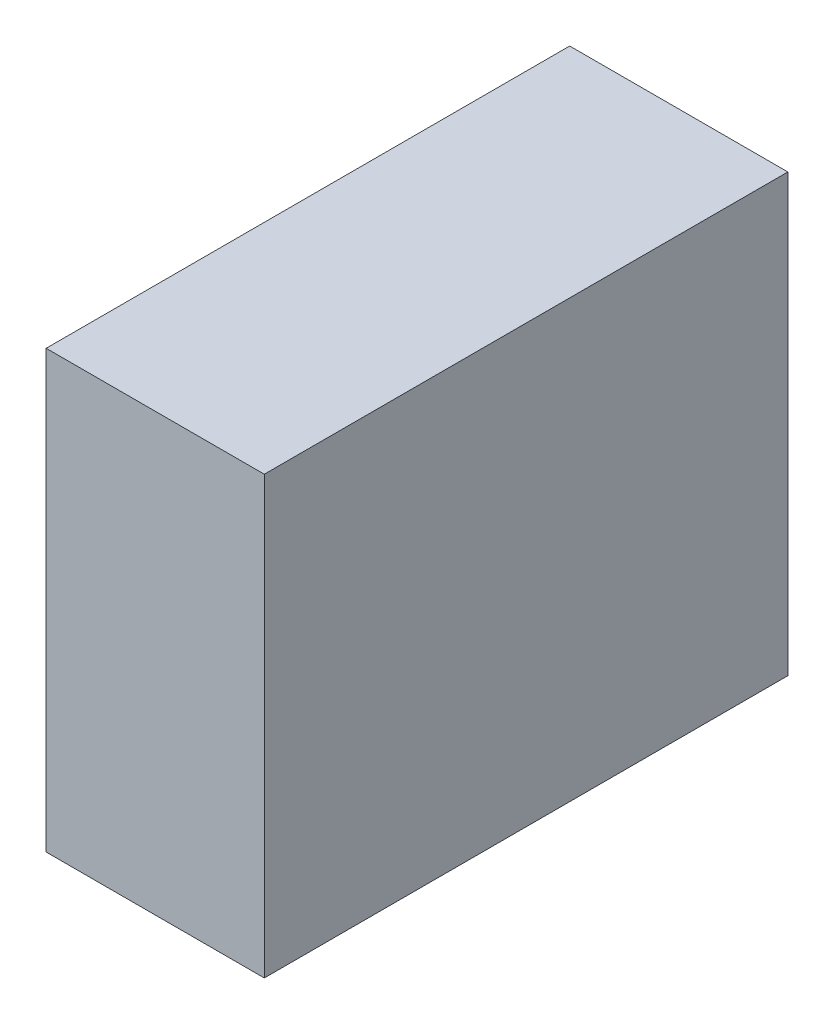
ISO-10303-21;
HEADER;
FILE_DESCRIPTION(('STEP AP214'),'2;1');
FILE_NAME('part.step','',(''),(''),'','','');
FILE_SCHEMA(('AUTOMOTIVE_DESIGN { 1 0 10303 214 1 1 1 1 }'));
ENDSEC;
DATA;
#1=APPLICATION_CONTEXT('core data for automotive mechanical design processes');
#2=APPLICATION_PROTOCOL_DEFINITION('international standard','automotive_design',2000,#1);
#3=PRODUCT_CONTEXT('',#1,'mechanical');
#4=PRODUCT('Part','Part','',(#3));
#5=PRODUCT_RELATED_PRODUCT_CATEGORY('part','',(#4));
#6=PRODUCT_DEFINITION_FORMATION('','',#4);
#7=PRODUCT_DEFINITION_CONTEXT('part definition',#1,'design');
#8=PRODUCT_DEFINITION('design','',#6,#7);
#9=PRODUCT_DEFINITION_SHAPE('','',#8);
#10=(LENGTH_UNIT() NAMED_UNIT(*) SI_UNIT(.MILLI.,.METRE.));
#11=(NAMED_UNIT(*) PLANE_ANGLE_UNIT() SI_UNIT($,.RADIAN.));
#12=(NAMED_UNIT(*) SI_UNIT($,.STERADIAN.) SOLID_ANGLE_UNIT());
#13=UNCERTAINTY_MEASURE_WITH_UNIT(LENGTH_MEASURE(1.E-05),#10,'distance_accuracy_value','');
#14=(GEOMETRIC_REPRESENTATION_CONTEXT(3) GLOBAL_UNCERTAINTY_ASSIGNED_CONTEXT((#13)) GLOBAL_UNIT_ASSIGNED_CONTEXT((#10,
#11,#12)) REPRESENTATION_CONTEXT('',''));
#15=CARTESIAN_POINT('',(0.,0.,0.));
#16=DIRECTION('',(0.,0.,1.));
#17=DIRECTION('',(1.,0.,0.));
#18=AXIS2_PLACEMENT_3D('',#15,#16,#17);
#19=CARTESIAN_POINT('',(320.,180.,-248.));
#20=DIRECTION('',(-1.,0.,0.));
#21=DIRECTION('',(0.,0.,1.));
#22=AXIS2_PLACEMENT_3D('',#19,#20,#21);
#23=PLANE('',#22);
#24=DIRECTION('',(0.,-1.,0.));
#25=VECTOR('',#24,1.);
#26=CARTESIAN_POINT('',(320.,180.,-128.));
#27=LINE('',#26,#25);
#28=CARTESIAN_POINT('',(320.,280.,-128.));
#29=VERTEX_POINT('',#28);
#30=CARTESIAN_POINT('',(320.,180.,-128.));
#31=VERTEX_POINT('',#30);
#32=EDGE_CURVE('E103',#29,#31,#27,.T.);
#33=ORIENTED_EDGE('',*,*,#32,.F.);
#34=DIRECTION('',(0.,0.,1.));
#35=VECTOR('',#34,1.);
#36=CARTESIAN_POINT('',(320.,280.,-248.));
#37=LINE('',#36,#35);
#38=CARTESIAN_POINT('',(320.,280.,-248.));
#39=VERTEX_POINT('',#38);
#40=EDGE_CURVE('E11',#39,#29,#37,.T.);
#41=ORIENTED_EDGE('',*,*,#40,.F.);
#42=DIRECTION('',(0.,-1.,0.));
#43=VECTOR('',#42,1.);
#44=CARTESIAN_POINT('',(320.,180.,-248.));
#45=LINE('',#44,#43);
#46=CARTESIAN_POINT('',(320.,180.,-248.));
#47=VERTEX_POINT('',#46);
#48=EDGE_CURVE('E97',#39,#47,#45,.T.);
#49=ORIENTED_EDGE('',*,*,#48,.T.);
#50=DIRECTION('',(0.,0.,1.));
#51=VECTOR('',#50,1.);
#52=CARTESIAN_POINT('',(320.,180.,-248.));
#53=LINE('',#52,#51);
#54=EDGE_CURVE('E42',#47,#31,#53,.T.);
#55=ORIENTED_EDGE('',*,*,#54,.T.);
#56=EDGE_LOOP('',(#33,#41,#49,#55));
#57=FACE_BOUND('',#56,.T.);
#58=ADVANCED_FACE('F39',(#57),#23,.T.);
#59=CARTESIAN_POINT('',(320.,280.,-248.));
#60=DIRECTION('',(0.,1.,0.));
#61=DIRECTION('',(0.,0.,1.));
#62=AXIS2_PLACEMENT_3D('',#59,#60,#61);
#63=PLANE('',#62);
#64=DIRECTION('',(-1.,0.,0.));
#65=VECTOR('',#64,1.);
#66=CARTESIAN_POINT('',(320.,280.,-128.));
#67=LINE('',#66,#65);
#68=CARTESIAN_POINT('',(370.,280.,-128.));
#69=VERTEX_POINT('',#68);
#70=EDGE_CURVE('E99',#69,#29,#67,.T.);
#71=ORIENTED_EDGE('',*,*,#70,.F.);
#72=DIRECTION('',(0.,0.,1.));
#73=VECTOR('',#72,1.);
#74=CARTESIAN_POINT('',(370.,280.,-248.));
#75=LINE('',#74,#73);
#76=CARTESIAN_POINT('',(370.,280.,-248.));
#77=VERTEX_POINT('',#76);
#78=EDGE_CURVE('E48',#77,#69,#75,.T.);
#79=ORIENTED_EDGE('',*,*,#78,.F.);
#80=DIRECTION('',(-1.,0.,0.));
#81=VECTOR('',#80,1.);
#82=CARTESIAN_POINT('',(320.,280.,-248.));
#83=LINE('',#82,#81);
#84=EDGE_CURVE('E94',#77,#39,#83,.T.);
#85=ORIENTED_EDGE('',*,*,#84,.T.);
#86=ORIENTED_EDGE('',*,*,#40,.T.);
#87=EDGE_LOOP('',(#71,#79,#85,#86));
#88=FACE_BOUND('',#87,.T.);
#89=ADVANCED_FACE('F113',(#88),#63,.T.);
#90=CARTESIAN_POINT('',(370.,180.,-248.));
#91=DIRECTION('',(1.,0.,0.));
#92=DIRECTION('',(0.,0.,-1.));
#93=AXIS2_PLACEMENT_3D('',#90,#91,#92);
#94=PLANE('',#93);
#95=DIRECTION('',(0.,1.,0.));
#96=VECTOR('',#95,1.);
#97=CARTESIAN_POINT('',(370.,180.,-128.));
#98=LINE('',#97,#96);
#99=CARTESIAN_POINT('',(370.,180.,-128.));
#100=VERTEX_POINT('',#99);
#101=EDGE_CURVE('E89',#100,#69,#98,.T.);
#102=ORIENTED_EDGE('',*,*,#101,.F.);
#103=DIRECTION('',(0.,0.,1.));
#104=VECTOR('',#103,1.);
#105=CARTESIAN_POINT('',(370.,180.,-248.));
#106=LINE('',#105,#104);
#107=CARTESIAN_POINT('',(370.,180.,-248.));
#108=VERTEX_POINT('',#107);
#109=EDGE_CURVE('E84',#108,#100,#106,.T.);
#110=ORIENTED_EDGE('',*,*,#109,.F.);
#111=DIRECTION('',(0.,1.,0.));
#112=VECTOR('',#111,1.);
#113=CARTESIAN_POINT('',(370.,180.,-248.));
#114=LINE('',#113,#112);
#115=EDGE_CURVE('E87',#108,#77,#114,.T.);
#116=ORIENTED_EDGE('',*,*,#115,.T.);
#117=ORIENTED_EDGE('',*,*,#78,.T.);
#118=EDGE_LOOP('',(#102,#110,#116,#117));
#119=FACE_BOUND('',#118,.T.);
#120=ADVANCED_FACE('F86',(#119),#94,.T.);
#121=CARTESIAN_POINT('',(320.,180.,-248.));
#122=DIRECTION('',(0.,-1.,0.));
#123=DIRECTION('',(0.,0.,-1.));
#124=AXIS2_PLACEMENT_3D('',#121,#122,#123);
#125=PLANE('',#124);
#126=DIRECTION('',(1.,0.,0.));
#127=VECTOR('',#126,1.);
#128=CARTESIAN_POINT('',(320.,180.,-128.));
#129=LINE('',#128,#127);
#130=EDGE_CURVE('E106',#31,#100,#129,.T.);
#131=ORIENTED_EDGE('',*,*,#130,.F.);
#132=ORIENTED_EDGE('',*,*,#54,.F.);
#133=DIRECTION('',(1.,0.,0.));
#134=VECTOR('',#133,1.);
#135=CARTESIAN_POINT('',(320.,180.,-248.));
#136=LINE('',#135,#134);
#137=EDGE_CURVE('E93',#47,#108,#136,.T.);
#138=ORIENTED_EDGE('',*,*,#137,.T.);
#139=ORIENTED_EDGE('',*,*,#109,.T.);
#140=EDGE_LOOP('',(#131,#132,#138,#139));
#141=FACE_BOUND('',#140,.T.);
#142=ADVANCED_FACE('F96',(#141),#125,.T.);
#143=CARTESIAN_POINT('',(0.,0.,-248.));
#144=DIRECTION('',(0.,0.,-1.));
#145=DIRECTION('',(-1.,0.,0.));
#146=AXIS2_PLACEMENT_3D('',#143,#144,#145);
#147=PLANE('',#146);
#148=ORIENTED_EDGE('',*,*,#48,.F.);
#149=ORIENTED_EDGE('',*,*,#84,.F.);
#150=ORIENTED_EDGE('',*,*,#115,.F.);
#151=ORIENTED_EDGE('',*,*,#137,.F.);
#152=EDGE_LOOP('',(#148,#149,#150,#151));
#153=FACE_BOUND('',#152,.T.);
#154=ADVANCED_FACE('F92',(#153),#147,.T.);
#155=CARTESIAN_POINT('',(0.,0.,-128.));
#156=DIRECTION('',(0.,0.,-1.));
#157=DIRECTION('',(-1.,0.,0.));
#158=AXIS2_PLACEMENT_3D('',#155,#156,#157);
#159=PLANE('',#158);
#160=ORIENTED_EDGE('',*,*,#32,.T.);
#161=ORIENTED_EDGE('',*,*,#130,.T.);
#162=ORIENTED_EDGE('',*,*,#101,.T.);
#163=ORIENTED_EDGE('',*,*,#70,.T.);
#164=EDGE_LOOP('',(#160,#161,#162,#163));
#165=FACE_BOUND('',#164,.T.);
#166=ADVANCED_FACE('F112',(#165),#159,.F.);
#167=CLOSED_SHELL('',(#58,#89,#120,#142,#154,#166));
#168=MANIFOLD_SOLID_BREP('B2',#167);
#169=ADVANCED_BREP_SHAPE_REPRESENTATION('',(#18,#168),#14);
#170=SHAPE_DEFINITION_REPRESENTATION(#9,#169);
ENDSEC;
END-ISO-10303-21;
